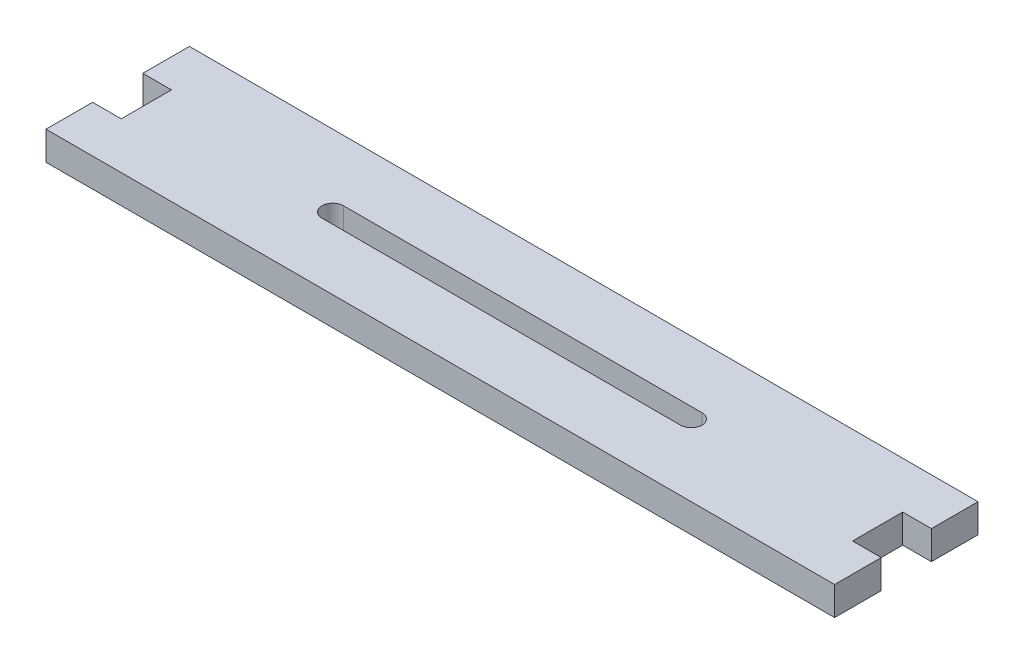
ISO-10303-21;
HEADER;
FILE_DESCRIPTION(('STEP AP214'),'2;1');
FILE_NAME('part.step','',(''),(''),'','','');
FILE_SCHEMA(('AUTOMOTIVE_DESIGN { 1 0 10303 214 1 1 1 1 }'));
ENDSEC;
DATA;
#1=APPLICATION_CONTEXT('core data for automotive mechanical design processes');
#2=APPLICATION_PROTOCOL_DEFINITION('international standard','automotive_design',2000,#1);
#3=PRODUCT_CONTEXT('',#1,'mechanical');
#4=PRODUCT('Part','Part','',(#3));
#5=PRODUCT_RELATED_PRODUCT_CATEGORY('part','',(#4));
#6=PRODUCT_DEFINITION_FORMATION('','',#4);
#7=PRODUCT_DEFINITION_CONTEXT('part definition',#1,'design');
#8=PRODUCT_DEFINITION('design','',#6,#7);
#9=PRODUCT_DEFINITION_SHAPE('','',#8);
#10=(LENGTH_UNIT() NAMED_UNIT(*) SI_UNIT(.MILLI.,.METRE.));
#11=(NAMED_UNIT(*) PLANE_ANGLE_UNIT() SI_UNIT($,.RADIAN.));
#12=(NAMED_UNIT(*) SI_UNIT($,.STERADIAN.) SOLID_ANGLE_UNIT());
#13=UNCERTAINTY_MEASURE_WITH_UNIT(LENGTH_MEASURE(1.E-05),#10,'distance_accuracy_value','');
#14=(GEOMETRIC_REPRESENTATION_CONTEXT(3) GLOBAL_UNCERTAINTY_ASSIGNED_CONTEXT((#13)) GLOBAL_UNIT_ASSIGNED_CONTEXT((#10,
#11,#12)) REPRESENTATION_CONTEXT('',''));
#15=CARTESIAN_POINT('',(0.,0.,0.));
#16=DIRECTION('',(0.,0.,1.));
#17=DIRECTION('',(1.,0.,0.));
#18=AXIS2_PLACEMENT_3D('',#15,#16,#17);
#19=CARTESIAN_POINT('',(0.,4.,0.));
#20=DIRECTION('',(0.,1.,0.));
#21=DIRECTION('',(0.,0.,1.));
#22=AXIS2_PLACEMENT_3D('',#19,#20,#21);
#23=PLANE('',#22);
#24=DIRECTION('',(-1.,0.,0.));
#25=VECTOR('',#24,1.);
#26=CARTESIAN_POINT('',(0.,4.,-3.5));
#27=LINE('',#26,#25);
#28=CARTESIAN_POINT('',(55.,4.,-3.5));
#29=VERTEX_POINT('',#28);
#30=CARTESIAN_POINT('',(51.,4.,-3.5));
#31=VERTEX_POINT('',#30);
#32=EDGE_CURVE('E182',#29,#31,#27,.T.);
#33=ORIENTED_EDGE('',*,*,#32,.F.);
#34=DIRECTION('',(0.,0.,1.));
#35=VECTOR('',#34,1.);
#36=CARTESIAN_POINT('',(55.,4.,0.));
#37=LINE('',#36,#35);
#38=CARTESIAN_POINT('',(55.,4.,-10.));
#39=VERTEX_POINT('',#38);
#40=EDGE_CURVE('E185',#39,#29,#37,.T.);
#41=ORIENTED_EDGE('',*,*,#40,.F.);
#42=DIRECTION('',(1.,0.,0.));
#43=VECTOR('',#42,1.);
#44=CARTESIAN_POINT('',(0.,4.,-10.));
#45=LINE('',#44,#43);
#46=CARTESIAN_POINT('',(-55.,4.,-10.));
#47=VERTEX_POINT('',#46);
#48=EDGE_CURVE('E189',#47,#39,#45,.T.);
#49=ORIENTED_EDGE('',*,*,#48,.F.);
#50=DIRECTION('',(0.,0.,1.));
#51=VECTOR('',#50,1.);
#52=CARTESIAN_POINT('',(-55.,4.,0.));
#53=LINE('',#52,#51);
#54=CARTESIAN_POINT('',(-55.,4.,-3.5));
#55=VERTEX_POINT('',#54);
#56=EDGE_CURVE('E193',#47,#55,#53,.T.);
#57=ORIENTED_EDGE('',*,*,#56,.T.);
#58=DIRECTION('',(1.,0.,0.));
#59=VECTOR('',#58,1.);
#60=CARTESIAN_POINT('',(0.,4.,-3.5));
#61=LINE('',#60,#59);
#62=CARTESIAN_POINT('',(-51.,4.,-3.5));
#63=VERTEX_POINT('',#62);
#64=EDGE_CURVE('E195',#55,#63,#61,.T.);
#65=ORIENTED_EDGE('',*,*,#64,.T.);
#66=DIRECTION('',(0.,0.,-1.));
#67=VECTOR('',#66,1.);
#68=CARTESIAN_POINT('',(-51.,4.,0.));
#69=LINE('',#68,#67);
#70=CARTESIAN_POINT('',(-51.,4.,3.5));
#71=VERTEX_POINT('',#70);
#72=EDGE_CURVE('E198',#71,#63,#69,.T.);
#73=ORIENTED_EDGE('',*,*,#72,.F.);
#74=DIRECTION('',(1.,0.,0.));
#75=VECTOR('',#74,1.);
#76=CARTESIAN_POINT('',(0.,4.,3.5));
#77=LINE('',#76,#75);
#78=CARTESIAN_POINT('',(-55.,4.,3.5));
#79=VERTEX_POINT('',#78);
#80=EDGE_CURVE('E201',#79,#71,#77,.T.);
#81=ORIENTED_EDGE('',*,*,#80,.F.);
#82=CARTESIAN_POINT('',(-55.,4.,10.));
#83=VERTEX_POINT('',#82);
#84=EDGE_CURVE('E196',#79,#83,#53,.T.);
#85=ORIENTED_EDGE('',*,*,#84,.T.);
#86=DIRECTION('',(1.,0.,0.));
#87=VECTOR('',#86,1.);
#88=CARTESIAN_POINT('',(0.,4.,10.));
#89=LINE('',#88,#87);
#90=CARTESIAN_POINT('',(55.,4.,10.));
#91=VERTEX_POINT('',#90);
#92=EDGE_CURVE('E204',#83,#91,#89,.T.);
#93=ORIENTED_EDGE('',*,*,#92,.T.);
#94=CARTESIAN_POINT('',(55.,4.,3.5));
#95=VERTEX_POINT('',#94);
#96=EDGE_CURVE('E190',#95,#91,#37,.T.);
#97=ORIENTED_EDGE('',*,*,#96,.F.);
#98=DIRECTION('',(-1.,0.,0.));
#99=VECTOR('',#98,1.);
#100=CARTESIAN_POINT('',(0.,4.,3.5));
#101=LINE('',#100,#99);
#102=CARTESIAN_POINT('',(51.,4.,3.5));
#103=VERTEX_POINT('',#102);
#104=EDGE_CURVE('E206',#95,#103,#101,.T.);
#105=ORIENTED_EDGE('',*,*,#104,.T.);
#106=DIRECTION('',(0.,0.,-1.));
#107=VECTOR('',#106,1.);
#108=CARTESIAN_POINT('',(51.,4.,0.));
#109=LINE('',#108,#107);
#110=EDGE_CURVE('E208',#103,#31,#109,.T.);
#111=ORIENTED_EDGE('',*,*,#110,.T.);
#112=EDGE_LOOP('',(#33,#41,#49,#57,#65,#73,#81,#85,#93,#97,#105,#111));
#113=FACE_BOUND('',#112,.T.);
#114=CARTESIAN_POINT('',(25.,4.,0.));
#115=DIRECTION('',(0.,-1.,0.));
#116=DIRECTION('',(0.,0.,-1.));
#117=AXIS2_PLACEMENT_3D('',#114,#115,#116);
#118=CIRCLE('',#117,1.5);
#119=CARTESIAN_POINT('',(25.,4.,-1.5));
#120=VERTEX_POINT('',#119);
#121=CARTESIAN_POINT('',(25.,4.,1.5));
#122=VERTEX_POINT('',#121);
#123=EDGE_CURVE('E154',#120,#122,#118,.T.);
#124=ORIENTED_EDGE('',*,*,#123,.T.);
#125=DIRECTION('',(1.,0.,0.));
#126=VECTOR('',#125,1.);
#127=CARTESIAN_POINT('',(0.,4.,1.5));
#128=LINE('',#127,#126);
#129=CARTESIAN_POINT('',(-25.,4.,1.5));
#130=VERTEX_POINT('',#129);
#131=EDGE_CURVE('E148',#130,#122,#128,.T.);
#132=ORIENTED_EDGE('',*,*,#131,.F.);
#133=CARTESIAN_POINT('',(-25.,4.,0.));
#134=DIRECTION('',(0.,-1.,0.));
#135=DIRECTION('',(0.,0.,-1.));
#136=AXIS2_PLACEMENT_3D('',#133,#134,#135);
#137=CIRCLE('',#136,1.5);
#138=CARTESIAN_POINT('',(-25.,4.,-1.5));
#139=VERTEX_POINT('',#138);
#140=EDGE_CURVE('E157',#130,#139,#137,.T.);
#141=ORIENTED_EDGE('',*,*,#140,.T.);
#142=DIRECTION('',(1.,0.,0.));
#143=VECTOR('',#142,1.);
#144=CARTESIAN_POINT('',(0.,4.,-1.5));
#145=LINE('',#144,#143);
#146=EDGE_CURVE('E50',#139,#120,#145,.T.);
#147=ORIENTED_EDGE('',*,*,#146,.T.);
#148=EDGE_LOOP('',(#124,#132,#141,#147));
#149=FACE_BOUND('',#148,.T.);
#150=ADVANCED_FACE('F35',(#113,#149),#23,.T.);
#151=CARTESIAN_POINT('',(0.,0.,0.));
#152=DIRECTION('',(0.,1.,0.));
#153=DIRECTION('',(0.,0.,1.));
#154=AXIS2_PLACEMENT_3D('',#151,#152,#153);
#155=PLANE('',#154);
#156=DIRECTION('',(-1.,0.,0.));
#157=VECTOR('',#156,1.);
#158=CARTESIAN_POINT('',(0.,0.,-3.5));
#159=LINE('',#158,#157);
#160=CARTESIAN_POINT('',(55.,0.,-3.5));
#161=VERTEX_POINT('',#160);
#162=CARTESIAN_POINT('',(51.,0.,-3.5));
#163=VERTEX_POINT('',#162);
#164=EDGE_CURVE('E178',#161,#163,#159,.T.);
#165=ORIENTED_EDGE('',*,*,#164,.T.);
#166=DIRECTION('',(0.,0.,-1.));
#167=VECTOR('',#166,1.);
#168=CARTESIAN_POINT('',(51.,0.,0.));
#169=LINE('',#168,#167);
#170=CARTESIAN_POINT('',(51.,0.,3.5));
#171=VERTEX_POINT('',#170);
#172=EDGE_CURVE('E186',#171,#163,#169,.T.);
#173=ORIENTED_EDGE('',*,*,#172,.F.);
#174=DIRECTION('',(-1.,0.,0.));
#175=VECTOR('',#174,1.);
#176=CARTESIAN_POINT('',(0.,0.,3.5));
#177=LINE('',#176,#175);
#178=CARTESIAN_POINT('',(55.,0.,3.5));
#179=VERTEX_POINT('',#178);
#180=EDGE_CURVE('E235',#179,#171,#177,.T.);
#181=ORIENTED_EDGE('',*,*,#180,.F.);
#182=DIRECTION('',(0.,0.,1.));
#183=VECTOR('',#182,1.);
#184=CARTESIAN_POINT('',(55.,0.,0.));
#185=LINE('',#184,#183);
#186=CARTESIAN_POINT('',(55.,0.,10.));
#187=VERTEX_POINT('',#186);
#188=EDGE_CURVE('E217',#179,#187,#185,.T.);
#189=ORIENTED_EDGE('',*,*,#188,.T.);
#190=DIRECTION('',(1.,0.,0.));
#191=VECTOR('',#190,1.);
#192=CARTESIAN_POINT('',(0.,0.,10.));
#193=LINE('',#192,#191);
#194=CARTESIAN_POINT('',(-55.,0.,10.));
#195=VERTEX_POINT('',#194);
#196=EDGE_CURVE('E232',#195,#187,#193,.T.);
#197=ORIENTED_EDGE('',*,*,#196,.F.);
#198=DIRECTION('',(0.,0.,1.));
#199=VECTOR('',#198,1.);
#200=CARTESIAN_POINT('',(-55.,0.,0.));
#201=LINE('',#200,#199);
#202=CARTESIAN_POINT('',(-55.,0.,3.5));
#203=VERTEX_POINT('',#202);
#204=EDGE_CURVE('E223',#203,#195,#201,.T.);
#205=ORIENTED_EDGE('',*,*,#204,.F.);
#206=DIRECTION('',(1.,0.,0.));
#207=VECTOR('',#206,1.);
#208=CARTESIAN_POINT('',(0.,0.,3.5));
#209=LINE('',#208,#207);
#210=CARTESIAN_POINT('',(-51.,0.,3.5));
#211=VERTEX_POINT('',#210);
#212=EDGE_CURVE('E229',#203,#211,#209,.T.);
#213=ORIENTED_EDGE('',*,*,#212,.T.);
#214=DIRECTION('',(0.,0.,-1.));
#215=VECTOR('',#214,1.);
#216=CARTESIAN_POINT('',(-51.,0.,0.));
#217=LINE('',#216,#215);
#218=CARTESIAN_POINT('',(-51.,0.,-3.5));
#219=VERTEX_POINT('',#218);
#220=EDGE_CURVE('E226',#211,#219,#217,.T.);
#221=ORIENTED_EDGE('',*,*,#220,.T.);
#222=DIRECTION('',(1.,0.,0.));
#223=VECTOR('',#222,1.);
#224=CARTESIAN_POINT('',(0.,0.,-3.5));
#225=LINE('',#224,#223);
#226=CARTESIAN_POINT('',(-55.,0.,-3.5));
#227=VERTEX_POINT('',#226);
#228=EDGE_CURVE('E222',#227,#219,#225,.T.);
#229=ORIENTED_EDGE('',*,*,#228,.F.);
#230=CARTESIAN_POINT('',(-55.,0.,-10.));
#231=VERTEX_POINT('',#230);
#232=EDGE_CURVE('E220',#231,#227,#201,.T.);
#233=ORIENTED_EDGE('',*,*,#232,.F.);
#234=DIRECTION('',(1.,0.,0.));
#235=VECTOR('',#234,1.);
#236=CARTESIAN_POINT('',(0.,0.,-10.));
#237=LINE('',#236,#235);
#238=CARTESIAN_POINT('',(55.,0.,-10.));
#239=VERTEX_POINT('',#238);
#240=EDGE_CURVE('E216',#231,#239,#237,.T.);
#241=ORIENTED_EDGE('',*,*,#240,.T.);
#242=EDGE_CURVE('E213',#239,#161,#185,.T.);
#243=ORIENTED_EDGE('',*,*,#242,.T.);
#244=EDGE_LOOP('',(#165,#173,#181,#189,#197,#205,#213,#221,#229,#233,#241,#243));
#245=FACE_BOUND('',#244,.T.);
#246=DIRECTION('',(1.,0.,0.));
#247=VECTOR('',#246,1.);
#248=CARTESIAN_POINT('',(0.,0.,1.5));
#249=LINE('',#248,#247);
#250=CARTESIAN_POINT('',(-25.,0.,1.5));
#251=VERTEX_POINT('',#250);
#252=CARTESIAN_POINT('',(25.,0.,1.5));
#253=VERTEX_POINT('',#252);
#254=EDGE_CURVE('E58',#251,#253,#249,.T.);
#255=ORIENTED_EDGE('',*,*,#254,.T.);
#256=CARTESIAN_POINT('',(25.,0.,0.));
#257=DIRECTION('',(0.,-1.,0.));
#258=DIRECTION('',(0.,0.,-1.));
#259=AXIS2_PLACEMENT_3D('',#256,#257,#258);
#260=CIRCLE('',#259,1.5);
#261=CARTESIAN_POINT('',(25.,0.,-1.5));
#262=VERTEX_POINT('',#261);
#263=EDGE_CURVE('E163',#262,#253,#260,.T.);
#264=ORIENTED_EDGE('',*,*,#263,.F.);
#265=DIRECTION('',(1.,0.,0.));
#266=VECTOR('',#265,1.);
#267=CARTESIAN_POINT('',(0.,0.,-1.5));
#268=LINE('',#267,#266);
#269=CARTESIAN_POINT('',(-25.,0.,-1.5));
#270=VERTEX_POINT('',#269);
#271=EDGE_CURVE('E166',#270,#262,#268,.T.);
#272=ORIENTED_EDGE('',*,*,#271,.F.);
#273=CARTESIAN_POINT('',(-25.,0.,0.));
#274=DIRECTION('',(0.,-1.,0.));
#275=DIRECTION('',(0.,0.,-1.));
#276=AXIS2_PLACEMENT_3D('',#273,#274,#275);
#277=CIRCLE('',#276,1.5);
#278=EDGE_CURVE('E172',#251,#270,#277,.T.);
#279=ORIENTED_EDGE('',*,*,#278,.F.);
#280=EDGE_LOOP('',(#255,#264,#272,#279));
#281=FACE_BOUND('',#280,.T.);
#282=ADVANCED_FACE('F271',(#245,#281),#155,.F.);
#283=CARTESIAN_POINT('',(0.,4.,-3.5));
#284=DIRECTION('',(0.,0.,1.));
#285=DIRECTION('',(1.,0.,0.));
#286=AXIS2_PLACEMENT_3D('',#283,#284,#285);
#287=PLANE('',#286);
#288=ORIENTED_EDGE('',*,*,#164,.F.);
#289=DIRECTION('',(0.,-1.,0.));
#290=VECTOR('',#289,1.);
#291=CARTESIAN_POINT('',(55.,4.,-3.5));
#292=LINE('',#291,#290);
#293=EDGE_CURVE('E11',#29,#161,#292,.T.);
#294=ORIENTED_EDGE('',*,*,#293,.F.);
#295=ORIENTED_EDGE('',*,*,#32,.T.);
#296=DIRECTION('',(0.,-1.,0.));
#297=VECTOR('',#296,1.);
#298=CARTESIAN_POINT('',(51.,4.,-3.5));
#299=LINE('',#298,#297);
#300=EDGE_CURVE('E210',#31,#163,#299,.T.);
#301=ORIENTED_EDGE('',*,*,#300,.T.);
#302=EDGE_LOOP('',(#288,#294,#295,#301));
#303=FACE_BOUND('',#302,.T.);
#304=ADVANCED_FACE('F37',(#303),#287,.T.);
#305=CARTESIAN_POINT('',(55.,4.,0.));
#306=DIRECTION('',(1.,0.,0.));
#307=DIRECTION('',(0.,0.,-1.));
#308=AXIS2_PLACEMENT_3D('',#305,#306,#307);
#309=PLANE('',#308);
#310=ORIENTED_EDGE('',*,*,#242,.F.);
#311=DIRECTION('',(0.,-1.,0.));
#312=VECTOR('',#311,1.);
#313=CARTESIAN_POINT('',(55.,4.,-10.));
#314=LINE('',#313,#312);
#315=EDGE_CURVE('E43',#39,#239,#314,.T.);
#316=ORIENTED_EDGE('',*,*,#315,.F.);
#317=ORIENTED_EDGE('',*,*,#40,.T.);
#318=ORIENTED_EDGE('',*,*,#293,.T.);
#319=EDGE_LOOP('',(#310,#316,#317,#318));
#320=FACE_BOUND('',#319,.T.);
#321=ADVANCED_FACE('F267',(#320),#309,.T.);
#322=CARTESIAN_POINT('',(0.,4.,-10.));
#323=DIRECTION('',(0.,0.,-1.));
#324=DIRECTION('',(-1.,0.,0.));
#325=AXIS2_PLACEMENT_3D('',#322,#323,#324);
#326=PLANE('',#325);
#327=ORIENTED_EDGE('',*,*,#240,.F.);
#328=DIRECTION('',(0.,-1.,0.));
#329=VECTOR('',#328,1.);
#330=CARTESIAN_POINT('',(-55.,4.,-10.));
#331=LINE('',#330,#329);
#332=EDGE_CURVE('E259',#47,#231,#331,.T.);
#333=ORIENTED_EDGE('',*,*,#332,.F.);
#334=ORIENTED_EDGE('',*,*,#48,.T.);
#335=ORIENTED_EDGE('',*,*,#315,.T.);
#336=EDGE_LOOP('',(#327,#333,#334,#335));
#337=FACE_BOUND('',#336,.T.);
#338=ADVANCED_FACE('F263',(#337),#326,.T.);
#339=CARTESIAN_POINT('',(-55.,4.,0.));
#340=DIRECTION('',(1.,0.,0.));
#341=DIRECTION('',(0.,0.,-1.));
#342=AXIS2_PLACEMENT_3D('',#339,#340,#341);
#343=PLANE('',#342);
#344=ORIENTED_EDGE('',*,*,#232,.T.);
#345=DIRECTION('',(0.,-1.,0.));
#346=VECTOR('',#345,1.);
#347=CARTESIAN_POINT('',(-55.,4.,-3.5));
#348=LINE('',#347,#346);
#349=EDGE_CURVE('E256',#55,#227,#348,.T.);
#350=ORIENTED_EDGE('',*,*,#349,.F.);
#351=ORIENTED_EDGE('',*,*,#56,.F.);
#352=ORIENTED_EDGE('',*,*,#332,.T.);
#353=EDGE_LOOP('',(#344,#350,#351,#352));
#354=FACE_BOUND('',#353,.T.);
#355=ADVANCED_FACE('F276',(#354),#343,.F.);
#356=CARTESIAN_POINT('',(0.,4.,-3.5));
#357=DIRECTION('',(0.,0.,-1.));
#358=DIRECTION('',(-1.,0.,0.));
#359=AXIS2_PLACEMENT_3D('',#356,#357,#358);
#360=PLANE('',#359);
#361=ORIENTED_EDGE('',*,*,#228,.T.);
#362=DIRECTION('',(0.,-1.,0.));
#363=VECTOR('',#362,1.);
#364=CARTESIAN_POINT('',(-51.,4.,-3.5));
#365=LINE('',#364,#363);
#366=EDGE_CURVE('E254',#63,#219,#365,.T.);
#367=ORIENTED_EDGE('',*,*,#366,.F.);
#368=ORIENTED_EDGE('',*,*,#64,.F.);
#369=ORIENTED_EDGE('',*,*,#349,.T.);
#370=EDGE_LOOP('',(#361,#367,#368,#369));
#371=FACE_BOUND('',#370,.T.);
#372=ADVANCED_FACE('F280',(#371),#360,.F.);
#373=CARTESIAN_POINT('',(-51.,4.,0.));
#374=DIRECTION('',(-1.,0.,0.));
#375=DIRECTION('',(0.,0.,1.));
#376=AXIS2_PLACEMENT_3D('',#373,#374,#375);
#377=PLANE('',#376);
#378=ORIENTED_EDGE('',*,*,#220,.F.);
#379=DIRECTION('',(0.,-1.,0.));
#380=VECTOR('',#379,1.);
#381=CARTESIAN_POINT('',(-51.,4.,3.5));
#382=LINE('',#381,#380);
#383=EDGE_CURVE('E252',#71,#211,#382,.T.);
#384=ORIENTED_EDGE('',*,*,#383,.F.);
#385=ORIENTED_EDGE('',*,*,#72,.T.);
#386=ORIENTED_EDGE('',*,*,#366,.T.);
#387=EDGE_LOOP('',(#378,#384,#385,#386));
#388=FACE_BOUND('',#387,.T.);
#389=ADVANCED_FACE('F318',(#388),#377,.T.);
#390=CARTESIAN_POINT('',(0.,4.,3.5));
#391=DIRECTION('',(0.,0.,-1.));
#392=DIRECTION('',(-1.,0.,0.));
#393=AXIS2_PLACEMENT_3D('',#390,#391,#392);
#394=PLANE('',#393);
#395=ORIENTED_EDGE('',*,*,#212,.F.);
#396=DIRECTION('',(0.,-1.,0.));
#397=VECTOR('',#396,1.);
#398=CARTESIAN_POINT('',(-55.,4.,3.5));
#399=LINE('',#398,#397);
#400=EDGE_CURVE('E250',#79,#203,#399,.T.);
#401=ORIENTED_EDGE('',*,*,#400,.F.);
#402=ORIENTED_EDGE('',*,*,#80,.T.);
#403=ORIENTED_EDGE('',*,*,#383,.T.);
#404=EDGE_LOOP('',(#395,#401,#402,#403));
#405=FACE_BOUND('',#404,.T.);
#406=ADVANCED_FACE('F315',(#405),#394,.T.);
#407=ORIENTED_EDGE('',*,*,#204,.T.);
#408=DIRECTION('',(0.,-1.,0.));
#409=VECTOR('',#408,1.);
#410=CARTESIAN_POINT('',(-55.,4.,10.));
#411=LINE('',#410,#409);
#412=EDGE_CURVE('E247',#83,#195,#411,.T.);
#413=ORIENTED_EDGE('',*,*,#412,.F.);
#414=ORIENTED_EDGE('',*,*,#84,.F.);
#415=ORIENTED_EDGE('',*,*,#400,.T.);
#416=EDGE_LOOP('',(#407,#413,#414,#415));
#417=FACE_BOUND('',#416,.T.);
#418=ADVANCED_FACE('F313',(#417),#343,.F.);
#419=CARTESIAN_POINT('',(0.,4.,10.));
#420=DIRECTION('',(0.,0.,-1.));
#421=DIRECTION('',(-1.,0.,0.));
#422=AXIS2_PLACEMENT_3D('',#419,#420,#421);
#423=PLANE('',#422);
#424=ORIENTED_EDGE('',*,*,#196,.T.);
#425=DIRECTION('',(0.,-1.,0.));
#426=VECTOR('',#425,1.);
#427=CARTESIAN_POINT('',(55.,4.,10.));
#428=LINE('',#427,#426);
#429=EDGE_CURVE('E245',#91,#187,#428,.T.);
#430=ORIENTED_EDGE('',*,*,#429,.F.);
#431=ORIENTED_EDGE('',*,*,#92,.F.);
#432=ORIENTED_EDGE('',*,*,#412,.T.);
#433=EDGE_LOOP('',(#424,#430,#431,#432));
#434=FACE_BOUND('',#433,.T.);
#435=ADVANCED_FACE('F308',(#434),#423,.F.);
#436=ORIENTED_EDGE('',*,*,#188,.F.);
#437=DIRECTION('',(0.,-1.,0.));
#438=VECTOR('',#437,1.);
#439=CARTESIAN_POINT('',(55.,4.,3.5));
#440=LINE('',#439,#438);
#441=EDGE_CURVE('E243',#95,#179,#440,.T.);
#442=ORIENTED_EDGE('',*,*,#441,.F.);
#443=ORIENTED_EDGE('',*,*,#96,.T.);
#444=ORIENTED_EDGE('',*,*,#429,.T.);
#445=EDGE_LOOP('',(#436,#442,#443,#444));
#446=FACE_BOUND('',#445,.T.);
#447=ADVANCED_FACE('F302',(#446),#309,.T.);
#448=CARTESIAN_POINT('',(0.,4.,3.5));
#449=DIRECTION('',(0.,0.,1.));
#450=DIRECTION('',(1.,0.,0.));
#451=AXIS2_PLACEMENT_3D('',#448,#449,#450);
#452=PLANE('',#451);
#453=ORIENTED_EDGE('',*,*,#180,.T.);
#454=DIRECTION('',(0.,-1.,0.));
#455=VECTOR('',#454,1.);
#456=CARTESIAN_POINT('',(51.,4.,3.5));
#457=LINE('',#456,#455);
#458=EDGE_CURVE('E240',#103,#171,#457,.T.);
#459=ORIENTED_EDGE('',*,*,#458,.F.);
#460=ORIENTED_EDGE('',*,*,#104,.F.);
#461=ORIENTED_EDGE('',*,*,#441,.T.);
#462=EDGE_LOOP('',(#453,#459,#460,#461));
#463=FACE_BOUND('',#462,.T.);
#464=ADVANCED_FACE('F298',(#463),#452,.F.);
#465=CARTESIAN_POINT('',(51.,4.,0.));
#466=DIRECTION('',(-1.,0.,0.));
#467=DIRECTION('',(0.,0.,1.));
#468=AXIS2_PLACEMENT_3D('',#465,#466,#467);
#469=PLANE('',#468);
#470=ORIENTED_EDGE('',*,*,#172,.T.);
#471=ORIENTED_EDGE('',*,*,#300,.F.);
#472=ORIENTED_EDGE('',*,*,#110,.F.);
#473=ORIENTED_EDGE('',*,*,#458,.T.);
#474=EDGE_LOOP('',(#470,#471,#472,#473));
#475=FACE_BOUND('',#474,.T.);
#476=ADVANCED_FACE('F294',(#475),#469,.F.);
#477=CARTESIAN_POINT('',(0.,4.,1.5));
#478=DIRECTION('',(0.,0.,-1.));
#479=DIRECTION('',(-1.,0.,0.));
#480=AXIS2_PLACEMENT_3D('',#477,#478,#479);
#481=PLANE('',#480);
#482=ORIENTED_EDGE('',*,*,#254,.F.);
#483=DIRECTION('',(0.,-1.,0.));
#484=VECTOR('',#483,1.);
#485=CARTESIAN_POINT('',(-25.,4.,1.5));
#486=LINE('',#485,#484);
#487=EDGE_CURVE('E144',#130,#251,#486,.T.);
#488=ORIENTED_EDGE('',*,*,#487,.F.);
#489=ORIENTED_EDGE('',*,*,#131,.T.);
#490=DIRECTION('',(0.,-1.,0.));
#491=VECTOR('',#490,1.);
#492=CARTESIAN_POINT('',(25.,4.,1.5));
#493=LINE('',#492,#491);
#494=EDGE_CURVE('E176',#122,#253,#493,.T.);
#495=ORIENTED_EDGE('',*,*,#494,.T.);
#496=EDGE_LOOP('',(#482,#488,#489,#495));
#497=FACE_BOUND('',#496,.T.);
#498=ADVANCED_FACE('F146',(#497),#481,.T.);
#499=CARTESIAN_POINT('',(25.,4.,0.));
#500=DIRECTION('',(0.,-1.,0.));
#501=DIRECTION('',(0.,0.,-1.));
#502=AXIS2_PLACEMENT_3D('',#499,#500,#501);
#503=CYLINDRICAL_SURFACE('',#502,1.5);
#504=ORIENTED_EDGE('',*,*,#263,.T.);
#505=ORIENTED_EDGE('',*,*,#494,.F.);
#506=ORIENTED_EDGE('',*,*,#123,.F.);
#507=DIRECTION('',(0.,-1.,0.));
#508=VECTOR('',#507,1.);
#509=CARTESIAN_POINT('',(25.,4.,-1.5));
#510=LINE('',#509,#508);
#511=EDGE_CURVE('E179',#120,#262,#510,.T.);
#512=ORIENTED_EDGE('',*,*,#511,.T.);
#513=EDGE_LOOP('',(#504,#505,#506,#512));
#514=FACE_BOUND('',#513,.T.);
#515=ADVANCED_FACE('F376',(#514),#503,.F.);
#516=CARTESIAN_POINT('',(0.,4.,-1.5));
#517=DIRECTION('',(0.,0.,-1.));
#518=DIRECTION('',(-1.,0.,0.));
#519=AXIS2_PLACEMENT_3D('',#516,#517,#518);
#520=PLANE('',#519);
#521=ORIENTED_EDGE('',*,*,#271,.T.);
#522=ORIENTED_EDGE('',*,*,#511,.F.);
#523=ORIENTED_EDGE('',*,*,#146,.F.);
#524=DIRECTION('',(0.,-1.,0.));
#525=VECTOR('',#524,1.);
#526=CARTESIAN_POINT('',(-25.,4.,-1.5));
#527=LINE('',#526,#525);
#528=EDGE_CURVE('E153',#139,#270,#527,.T.);
#529=ORIENTED_EDGE('',*,*,#528,.T.);
#530=EDGE_LOOP('',(#521,#522,#523,#529));
#531=FACE_BOUND('',#530,.T.);
#532=ADVANCED_FACE('F384',(#531),#520,.F.);
#533=CARTESIAN_POINT('',(-25.,4.,0.));
#534=DIRECTION('',(0.,-1.,0.));
#535=DIRECTION('',(0.,0.,-1.));
#536=AXIS2_PLACEMENT_3D('',#533,#534,#535);
#537=CYLINDRICAL_SURFACE('',#536,1.5);
#538=ORIENTED_EDGE('',*,*,#278,.T.);
#539=ORIENTED_EDGE('',*,*,#528,.F.);
#540=ORIENTED_EDGE('',*,*,#140,.F.);
#541=ORIENTED_EDGE('',*,*,#487,.T.);
#542=EDGE_LOOP('',(#538,#539,#540,#541));
#543=FACE_BOUND('',#542,.T.);
#544=ADVANCED_FACE('F158',(#543),#537,.F.);
#545=CLOSED_SHELL('',(#150,#282,#304,#321,#338,#355,#372,#389,#406,#418,#435,#447,#464,#476,
#498,#515,#532,#544));
#546=MANIFOLD_SOLID_BREP('B2',#545);
#547=ADVANCED_BREP_SHAPE_REPRESENTATION('',(#18,#546),#14);
#548=SHAPE_DEFINITION_REPRESENTATION(#9,#547);
ENDSEC;
END-ISO-10303-21;
